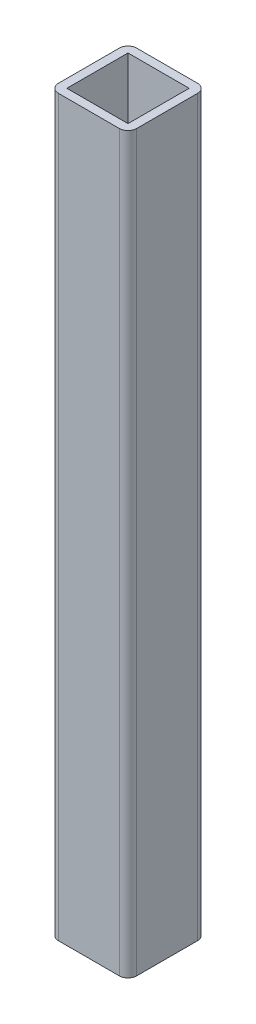
ISO-10303-21;
HEADER;
FILE_DESCRIPTION(('STEP AP214'),'2;1');
FILE_NAME('part.step','',(''),(''),'','','');
FILE_SCHEMA(('AUTOMOTIVE_DESIGN { 1 0 10303 214 1 1 1 1 }'));
ENDSEC;
DATA;
#1=APPLICATION_CONTEXT('core data for automotive mechanical design processes');
#2=APPLICATION_PROTOCOL_DEFINITION('international standard','automotive_design',2000,#1);
#3=PRODUCT_CONTEXT('',#1,'mechanical');
#4=PRODUCT('Part','Part','',(#3));
#5=PRODUCT_RELATED_PRODUCT_CATEGORY('part','',(#4));
#6=PRODUCT_DEFINITION_FORMATION('','',#4);
#7=PRODUCT_DEFINITION_CONTEXT('part definition',#1,'design');
#8=PRODUCT_DEFINITION('design','',#6,#7);
#9=PRODUCT_DEFINITION_SHAPE('','',#8);
#10=(LENGTH_UNIT() NAMED_UNIT(*) SI_UNIT(.MILLI.,.METRE.));
#11=(NAMED_UNIT(*) PLANE_ANGLE_UNIT() SI_UNIT($,.RADIAN.));
#12=(NAMED_UNIT(*) SI_UNIT($,.STERADIAN.) SOLID_ANGLE_UNIT());
#13=UNCERTAINTY_MEASURE_WITH_UNIT(LENGTH_MEASURE(1.E-05),#10,'distance_accuracy_value','');
#14=(GEOMETRIC_REPRESENTATION_CONTEXT(3) GLOBAL_UNCERTAINTY_ASSIGNED_CONTEXT((#13)) GLOBAL_UNIT_ASSIGNED_CONTEXT((#10,
#11,#12)) REPRESENTATION_CONTEXT('',''));
#15=CARTESIAN_POINT('',(0.,0.,0.));
#16=DIRECTION('',(0.,0.,1.));
#17=DIRECTION('',(1.,0.,0.));
#18=AXIS2_PLACEMENT_3D('',#15,#16,#17);
#19=CARTESIAN_POINT('',(22.8,240.,2.8));
#20=DIRECTION('',(0.,-1.,0.));
#21=DIRECTION('',(0.,0.,-1.));
#22=AXIS2_PLACEMENT_3D('',#19,#20,#21);
#23=CYLINDRICAL_SURFACE('',#22,2.8);
#24=CARTESIAN_POINT('',(22.8,0.,2.8));
#25=DIRECTION('',(0.,1.,0.));
#26=DIRECTION('',(0.,0.,-1.));
#27=AXIS2_PLACEMENT_3D('',#24,#25,#26);
#28=CIRCLE('',#27,2.8);
#29=CARTESIAN_POINT('',(25.6,0.,2.80000000000002));
#30=VERTEX_POINT('',#29);
#31=CARTESIAN_POINT('',(22.8,0.,0.));
#32=VERTEX_POINT('',#31);
#33=EDGE_CURVE('E159',#30,#32,#28,.T.);
#34=ORIENTED_EDGE('',*,*,#33,.T.);
#35=DIRECTION('',(0.,-1.,0.));
#36=VECTOR('',#35,1.);
#37=CARTESIAN_POINT('',(22.8,240.,0.));
#38=LINE('',#37,#36);
#39=CARTESIAN_POINT('',(22.8,240.,0.));
#40=VERTEX_POINT('',#39);
#41=EDGE_CURVE('E11',#40,#32,#38,.T.);
#42=ORIENTED_EDGE('',*,*,#41,.F.);
#43=CARTESIAN_POINT('',(22.8,240.,2.8));
#44=DIRECTION('',(0.,1.,0.));
#45=DIRECTION('',(0.,0.,-1.));
#46=AXIS2_PLACEMENT_3D('',#43,#44,#45);
#47=CIRCLE('',#46,2.8);
#48=CARTESIAN_POINT('',(25.6,240.,2.80000000000002));
#49=VERTEX_POINT('',#48);
#50=EDGE_CURVE('E160',#49,#40,#47,.T.);
#51=ORIENTED_EDGE('',*,*,#50,.F.);
#52=DIRECTION('',(0.,-1.,0.));
#53=VECTOR('',#52,1.);
#54=CARTESIAN_POINT('',(25.6,240.,2.80000000000002));
#55=LINE('',#54,#53);
#56=EDGE_CURVE('E178',#49,#30,#55,.T.);
#57=ORIENTED_EDGE('',*,*,#56,.T.);
#58=EDGE_LOOP('',(#34,#42,#51,#57));
#59=FACE_BOUND('',#58,.T.);
#60=ADVANCED_FACE('F34',(#59),#23,.T.);
#61=CARTESIAN_POINT('',(2.80000000000002,240.,0.));
#62=DIRECTION('',(0.,0.,1.));
#63=DIRECTION('',(1.,0.,0.));
#64=AXIS2_PLACEMENT_3D('',#61,#62,#63);
#65=PLANE('',#64);
#66=DIRECTION('',(-1.,0.,0.));
#67=VECTOR('',#66,1.);
#68=CARTESIAN_POINT('',(2.80000000000002,0.,0.));
#69=LINE('',#68,#67);
#70=CARTESIAN_POINT('',(2.80000000000002,0.,0.));
#71=VERTEX_POINT('',#70);
#72=EDGE_CURVE('E181',#32,#71,#69,.T.);
#73=ORIENTED_EDGE('',*,*,#72,.T.);
#74=DIRECTION('',(0.,-1.,0.));
#75=VECTOR('',#74,1.);
#76=CARTESIAN_POINT('',(2.80000000000002,240.,0.));
#77=LINE('',#76,#75);
#78=CARTESIAN_POINT('',(2.80000000000002,240.,0.));
#79=VERTEX_POINT('',#78);
#80=EDGE_CURVE('E41',#79,#71,#77,.T.);
#81=ORIENTED_EDGE('',*,*,#80,.F.);
#82=DIRECTION('',(-1.,0.,0.));
#83=VECTOR('',#82,1.);
#84=CARTESIAN_POINT('',(2.80000000000002,240.,0.));
#85=LINE('',#84,#83);
#86=EDGE_CURVE('E163',#40,#79,#85,.T.);
#87=ORIENTED_EDGE('',*,*,#86,.F.);
#88=ORIENTED_EDGE('',*,*,#41,.T.);
#89=EDGE_LOOP('',(#73,#81,#87,#88));
#90=FACE_BOUND('',#89,.T.);
#91=ADVANCED_FACE('F236',(#90),#65,.F.);
#92=CARTESIAN_POINT('',(2.8,240.,2.8));
#93=DIRECTION('',(0.,-1.,0.));
#94=DIRECTION('',(0.,0.,-1.));
#95=AXIS2_PLACEMENT_3D('',#92,#93,#94);
#96=CYLINDRICAL_SURFACE('',#95,2.8);
#97=CARTESIAN_POINT('',(2.8,0.,2.8));
#98=DIRECTION('',(0.,1.,0.));
#99=DIRECTION('',(0.,0.,1.));
#100=AXIS2_PLACEMENT_3D('',#97,#98,#99);
#101=CIRCLE('',#100,2.8);
#102=CARTESIAN_POINT('',(0.,0.,2.80000000000002));
#103=VERTEX_POINT('',#102);
#104=EDGE_CURVE('E183',#71,#103,#101,.T.);
#105=ORIENTED_EDGE('',*,*,#104,.T.);
#106=DIRECTION('',(0.,-1.,0.));
#107=VECTOR('',#106,1.);
#108=CARTESIAN_POINT('',(0.,240.,2.80000000000002));
#109=LINE('',#108,#107);
#110=CARTESIAN_POINT('',(0.,240.,2.80000000000002));
#111=VERTEX_POINT('',#110);
#112=EDGE_CURVE('E208',#111,#103,#109,.T.);
#113=ORIENTED_EDGE('',*,*,#112,.F.);
#114=CARTESIAN_POINT('',(2.8,240.,2.8));
#115=DIRECTION('',(0.,1.,0.));
#116=DIRECTION('',(0.,0.,1.));
#117=AXIS2_PLACEMENT_3D('',#114,#115,#116);
#118=CIRCLE('',#117,2.8);
#119=EDGE_CURVE('E166',#79,#111,#118,.T.);
#120=ORIENTED_EDGE('',*,*,#119,.F.);
#121=ORIENTED_EDGE('',*,*,#80,.T.);
#122=EDGE_LOOP('',(#105,#113,#120,#121));
#123=FACE_BOUND('',#122,.T.);
#124=ADVANCED_FACE('F215',(#123),#96,.T.);
#125=CARTESIAN_POINT('',(0.,240.,2.80000000000002));
#126=DIRECTION('',(1.,0.,0.));
#127=DIRECTION('',(0.,0.,-1.));
#128=AXIS2_PLACEMENT_3D('',#125,#126,#127);
#129=PLANE('',#128);
#130=DIRECTION('',(0.,0.,1.));
#131=VECTOR('',#130,1.);
#132=CARTESIAN_POINT('',(0.,0.,2.80000000000002));
#133=LINE('',#132,#131);
#134=CARTESIAN_POINT('',(0.,0.,22.8));
#135=VERTEX_POINT('',#134);
#136=EDGE_CURVE('E185',#103,#135,#133,.T.);
#137=ORIENTED_EDGE('',*,*,#136,.T.);
#138=DIRECTION('',(0.,-1.,0.));
#139=VECTOR('',#138,1.);
#140=CARTESIAN_POINT('',(0.,240.,22.8));
#141=LINE('',#140,#139);
#142=CARTESIAN_POINT('',(0.,240.,22.8));
#143=VERTEX_POINT('',#142);
#144=EDGE_CURVE('E205',#143,#135,#141,.T.);
#145=ORIENTED_EDGE('',*,*,#144,.F.);
#146=DIRECTION('',(0.,0.,1.));
#147=VECTOR('',#146,1.);
#148=CARTESIAN_POINT('',(0.,240.,2.80000000000002));
#149=LINE('',#148,#147);
#150=EDGE_CURVE('E168',#111,#143,#149,.T.);
#151=ORIENTED_EDGE('',*,*,#150,.F.);
#152=ORIENTED_EDGE('',*,*,#112,.T.);
#153=EDGE_LOOP('',(#137,#145,#151,#152));
#154=FACE_BOUND('',#153,.T.);
#155=ADVANCED_FACE('F224',(#154),#129,.F.);
#156=CARTESIAN_POINT('',(2.8,240.,22.8));
#157=DIRECTION('',(0.,-1.,0.));
#158=DIRECTION('',(0.,0.,-1.));
#159=AXIS2_PLACEMENT_3D('',#156,#157,#158);
#160=CYLINDRICAL_SURFACE('',#159,2.8);
#161=CARTESIAN_POINT('',(2.8,0.,22.8));
#162=DIRECTION('',(0.,1.,0.));
#163=DIRECTION('',(0.,0.,1.));
#164=AXIS2_PLACEMENT_3D('',#161,#162,#163);
#165=CIRCLE('',#164,2.8);
#166=CARTESIAN_POINT('',(2.80000000000002,0.,25.6));
#167=VERTEX_POINT('',#166);
#168=EDGE_CURVE('E187',#135,#167,#165,.T.);
#169=ORIENTED_EDGE('',*,*,#168,.T.);
#170=DIRECTION('',(0.,-1.,0.));
#171=VECTOR('',#170,1.);
#172=CARTESIAN_POINT('',(2.80000000000002,240.,25.6));
#173=LINE('',#172,#171);
#174=CARTESIAN_POINT('',(2.80000000000002,240.,25.6));
#175=VERTEX_POINT('',#174);
#176=EDGE_CURVE('E202',#175,#167,#173,.T.);
#177=ORIENTED_EDGE('',*,*,#176,.F.);
#178=CARTESIAN_POINT('',(2.8,240.,22.8));
#179=DIRECTION('',(0.,1.,0.));
#180=DIRECTION('',(0.,0.,1.));
#181=AXIS2_PLACEMENT_3D('',#178,#179,#180);
#182=CIRCLE('',#181,2.8);
#183=EDGE_CURVE('E170',#143,#175,#182,.T.);
#184=ORIENTED_EDGE('',*,*,#183,.F.);
#185=ORIENTED_EDGE('',*,*,#144,.T.);
#186=EDGE_LOOP('',(#169,#177,#184,#185));
#187=FACE_BOUND('',#186,.T.);
#188=ADVANCED_FACE('F228',(#187),#160,.T.);
#189=CARTESIAN_POINT('',(2.80000000000002,240.,25.6));
#190=DIRECTION('',(0.,0.,-1.));
#191=DIRECTION('',(-1.,0.,0.));
#192=AXIS2_PLACEMENT_3D('',#189,#190,#191);
#193=PLANE('',#192);
#194=DIRECTION('',(1.,0.,0.));
#195=VECTOR('',#194,1.);
#196=CARTESIAN_POINT('',(2.80000000000002,0.,25.6));
#197=LINE('',#196,#195);
#198=CARTESIAN_POINT('',(22.8,0.,25.6));
#199=VERTEX_POINT('',#198);
#200=EDGE_CURVE('E189',#167,#199,#197,.T.);
#201=ORIENTED_EDGE('',*,*,#200,.T.);
#202=DIRECTION('',(0.,-1.,0.));
#203=VECTOR('',#202,1.);
#204=CARTESIAN_POINT('',(22.8,240.,25.6));
#205=LINE('',#204,#203);
#206=CARTESIAN_POINT('',(22.8,240.,25.6));
#207=VERTEX_POINT('',#206);
#208=EDGE_CURVE('E199',#207,#199,#205,.T.);
#209=ORIENTED_EDGE('',*,*,#208,.F.);
#210=DIRECTION('',(1.,0.,0.));
#211=VECTOR('',#210,1.);
#212=CARTESIAN_POINT('',(2.80000000000002,240.,25.6));
#213=LINE('',#212,#211);
#214=EDGE_CURVE('E172',#175,#207,#213,.T.);
#215=ORIENTED_EDGE('',*,*,#214,.F.);
#216=ORIENTED_EDGE('',*,*,#176,.T.);
#217=EDGE_LOOP('',(#201,#209,#215,#216));
#218=FACE_BOUND('',#217,.T.);
#219=ADVANCED_FACE('F249',(#218),#193,.F.);
#220=CARTESIAN_POINT('',(22.8,240.,22.8));
#221=DIRECTION('',(0.,-1.,0.));
#222=DIRECTION('',(0.,0.,-1.));
#223=AXIS2_PLACEMENT_3D('',#220,#221,#222);
#224=CYLINDRICAL_SURFACE('',#223,2.8);
#225=CARTESIAN_POINT('',(22.8,0.,22.8));
#226=DIRECTION('',(0.,1.,0.));
#227=DIRECTION('',(0.,0.,1.));
#228=AXIS2_PLACEMENT_3D('',#225,#226,#227);
#229=CIRCLE('',#228,2.8);
#230=CARTESIAN_POINT('',(25.6,0.,22.8));
#231=VERTEX_POINT('',#230);
#232=EDGE_CURVE('E191',#199,#231,#229,.T.);
#233=ORIENTED_EDGE('',*,*,#232,.T.);
#234=DIRECTION('',(0.,-1.,0.));
#235=VECTOR('',#234,1.);
#236=CARTESIAN_POINT('',(25.6,240.,22.8));
#237=LINE('',#236,#235);
#238=CARTESIAN_POINT('',(25.6,240.,22.8));
#239=VERTEX_POINT('',#238);
#240=EDGE_CURVE('E196',#239,#231,#237,.T.);
#241=ORIENTED_EDGE('',*,*,#240,.F.);
#242=CARTESIAN_POINT('',(22.8,240.,22.8));
#243=DIRECTION('',(0.,1.,0.));
#244=DIRECTION('',(0.,0.,1.));
#245=AXIS2_PLACEMENT_3D('',#242,#243,#244);
#246=CIRCLE('',#245,2.8);
#247=EDGE_CURVE('E174',#207,#239,#246,.T.);
#248=ORIENTED_EDGE('',*,*,#247,.F.);
#249=ORIENTED_EDGE('',*,*,#208,.T.);
#250=EDGE_LOOP('',(#233,#241,#248,#249));
#251=FACE_BOUND('',#250,.T.);
#252=ADVANCED_FACE('F247',(#251),#224,.T.);
#253=CARTESIAN_POINT('',(25.6,240.,2.80000000000002));
#254=DIRECTION('',(-1.,0.,0.));
#255=DIRECTION('',(0.,0.,1.));
#256=AXIS2_PLACEMENT_3D('',#253,#254,#255);
#257=PLANE('',#256);
#258=DIRECTION('',(0.,0.,-1.));
#259=VECTOR('',#258,1.);
#260=CARTESIAN_POINT('',(25.6,0.,2.80000000000002));
#261=LINE('',#260,#259);
#262=EDGE_CURVE('E164',#231,#30,#261,.T.);
#263=ORIENTED_EDGE('',*,*,#262,.T.);
#264=ORIENTED_EDGE('',*,*,#56,.F.);
#265=DIRECTION('',(0.,0.,-1.));
#266=VECTOR('',#265,1.);
#267=CARTESIAN_POINT('',(25.6,240.,2.80000000000002));
#268=LINE('',#267,#266);
#269=EDGE_CURVE('E176',#239,#49,#268,.T.);
#270=ORIENTED_EDGE('',*,*,#269,.F.);
#271=ORIENTED_EDGE('',*,*,#240,.T.);
#272=EDGE_LOOP('',(#263,#264,#270,#271));
#273=FACE_BOUND('',#272,.T.);
#274=ADVANCED_FACE('F242',(#273),#257,.F.);
#275=CARTESIAN_POINT('',(22.8,240.,2.8));
#276=DIRECTION('',(0.,-1.,0.));
#277=DIRECTION('',(0.,0.,-1.));
#278=AXIS2_PLACEMENT_3D('',#275,#276,#277);
#279=PLANE('',#278);
#280=DIRECTION('',(1.,0.,0.));
#281=VECTOR('',#280,1.);
#282=CARTESIAN_POINT('',(22.8,240.,2.8));
#283=LINE('',#282,#281);
#284=CARTESIAN_POINT('',(2.8,240.,2.8));
#285=VERTEX_POINT('',#284);
#286=CARTESIAN_POINT('',(22.8,240.,2.8));
#287=VERTEX_POINT('',#286);
#288=EDGE_CURVE('E153',#285,#287,#283,.T.);
#289=ORIENTED_EDGE('',*,*,#288,.T.);
#290=DIRECTION('',(0.,0.,1.));
#291=VECTOR('',#290,1.);
#292=CARTESIAN_POINT('',(22.8,240.,2.8));
#293=LINE('',#292,#291);
#294=CARTESIAN_POINT('',(22.8,240.,22.8));
#295=VERTEX_POINT('',#294);
#296=EDGE_CURVE('E156',#287,#295,#293,.T.);
#297=ORIENTED_EDGE('',*,*,#296,.T.);
#298=DIRECTION('',(-1.,0.,0.));
#299=VECTOR('',#298,1.);
#300=CARTESIAN_POINT('',(22.8,240.,22.8));
#301=LINE('',#300,#299);
#302=CARTESIAN_POINT('',(2.8,240.,22.8));
#303=VERTEX_POINT('',#302);
#304=EDGE_CURVE('E148',#295,#303,#301,.T.);
#305=ORIENTED_EDGE('',*,*,#304,.T.);
#306=DIRECTION('',(0.,0.,-1.));
#307=VECTOR('',#306,1.);
#308=CARTESIAN_POINT('',(2.8,240.,2.79999999999999));
#309=LINE('',#308,#307);
#310=EDGE_CURVE('E128',#303,#285,#309,.T.);
#311=ORIENTED_EDGE('',*,*,#310,.T.);
#312=EDGE_LOOP('',(#289,#297,#305,#311));
#313=FACE_BOUND('',#312,.T.);
#314=ORIENTED_EDGE('',*,*,#50,.T.);
#315=ORIENTED_EDGE('',*,*,#86,.T.);
#316=ORIENTED_EDGE('',*,*,#119,.T.);
#317=ORIENTED_EDGE('',*,*,#150,.T.);
#318=ORIENTED_EDGE('',*,*,#183,.T.);
#319=ORIENTED_EDGE('',*,*,#214,.T.);
#320=ORIENTED_EDGE('',*,*,#247,.T.);
#321=ORIENTED_EDGE('',*,*,#269,.T.);
#322=EDGE_LOOP('',(#314,#315,#316,#317,#318,#319,#320,#321));
#323=FACE_BOUND('',#322,.T.);
#324=ADVANCED_FACE('F232',(#313,#323),#279,.F.);
#325=CARTESIAN_POINT('',(22.8,0.,2.8));
#326=DIRECTION('',(0.,-1.,0.));
#327=DIRECTION('',(0.,0.,-1.));
#328=AXIS2_PLACEMENT_3D('',#325,#326,#327);
#329=PLANE('',#328);
#330=DIRECTION('',(0.,0.,1.));
#331=VECTOR('',#330,1.);
#332=CARTESIAN_POINT('',(22.8,0.,2.8));
#333=LINE('',#332,#331);
#334=CARTESIAN_POINT('',(22.8,0.,2.8));
#335=VERTEX_POINT('',#334);
#336=CARTESIAN_POINT('',(22.8,0.,22.8));
#337=VERTEX_POINT('',#336);
#338=EDGE_CURVE('E56',#335,#337,#333,.T.);
#339=ORIENTED_EDGE('',*,*,#338,.F.);
#340=DIRECTION('',(1.,0.,0.));
#341=VECTOR('',#340,1.);
#342=CARTESIAN_POINT('',(2.8,0.,2.8));
#343=LINE('',#342,#341);
#344=CARTESIAN_POINT('',(2.8,0.,2.8));
#345=VERTEX_POINT('',#344);
#346=EDGE_CURVE('E141',#345,#335,#343,.T.);
#347=ORIENTED_EDGE('',*,*,#346,.F.);
#348=DIRECTION('',(0.,0.,-1.));
#349=VECTOR('',#348,1.);
#350=CARTESIAN_POINT('',(2.8,0.,2.8));
#351=LINE('',#350,#349);
#352=CARTESIAN_POINT('',(2.8,0.,22.8));
#353=VERTEX_POINT('',#352);
#354=EDGE_CURVE('E125',#353,#345,#351,.T.);
#355=ORIENTED_EDGE('',*,*,#354,.F.);
#356=DIRECTION('',(-1.,0.,0.));
#357=VECTOR('',#356,1.);
#358=CARTESIAN_POINT('',(2.8,0.,22.8));
#359=LINE('',#358,#357);
#360=EDGE_CURVE('E134',#337,#353,#359,.T.);
#361=ORIENTED_EDGE('',*,*,#360,.F.);
#362=EDGE_LOOP('',(#339,#347,#355,#361));
#363=FACE_BOUND('',#362,.T.);
#364=ORIENTED_EDGE('',*,*,#33,.F.);
#365=ORIENTED_EDGE('',*,*,#262,.F.);
#366=ORIENTED_EDGE('',*,*,#232,.F.);
#367=ORIENTED_EDGE('',*,*,#200,.F.);
#368=ORIENTED_EDGE('',*,*,#168,.F.);
#369=ORIENTED_EDGE('',*,*,#136,.F.);
#370=ORIENTED_EDGE('',*,*,#104,.F.);
#371=ORIENTED_EDGE('',*,*,#72,.F.);
#372=EDGE_LOOP('',(#364,#365,#366,#367,#368,#369,#370,#371));
#373=FACE_BOUND('',#372,.T.);
#374=ADVANCED_FACE('F138',(#363,#373),#329,.T.);
#375=CARTESIAN_POINT('',(22.8,1040.5,2.8));
#376=DIRECTION('',(1.,0.,0.));
#377=DIRECTION('',(0.,0.,-1.));
#378=AXIS2_PLACEMENT_3D('',#375,#376,#377);
#379=PLANE('',#378);
#380=DIRECTION('',(0.,-1.,0.));
#381=VECTOR('',#380,1.);
#382=CARTESIAN_POINT('',(22.8,1040.5,2.8));
#383=LINE('',#382,#381);
#384=EDGE_CURVE('E146',#287,#335,#383,.T.);
#385=ORIENTED_EDGE('',*,*,#384,.T.);
#386=ORIENTED_EDGE('',*,*,#338,.T.);
#387=DIRECTION('',(0.,-1.,0.));
#388=VECTOR('',#387,1.);
#389=CARTESIAN_POINT('',(22.8,1040.5,22.8));
#390=LINE('',#389,#388);
#391=EDGE_CURVE('E131',#295,#337,#390,.T.);
#392=ORIENTED_EDGE('',*,*,#391,.F.);
#393=ORIENTED_EDGE('',*,*,#296,.F.);
#394=EDGE_LOOP('',(#385,#386,#392,#393));
#395=FACE_BOUND('',#394,.T.);
#396=ADVANCED_FACE('F312',(#395),#379,.F.);
#397=CARTESIAN_POINT('',(2.8,1040.5,2.8));
#398=DIRECTION('',(0.,0.,-1.));
#399=DIRECTION('',(-1.,0.,0.));
#400=AXIS2_PLACEMENT_3D('',#397,#398,#399);
#401=PLANE('',#400);
#402=DIRECTION('',(0.,-1.,0.));
#403=VECTOR('',#402,1.);
#404=CARTESIAN_POINT('',(2.8,1040.5,2.8));
#405=LINE('',#404,#403);
#406=EDGE_CURVE('E130',#285,#345,#405,.T.);
#407=ORIENTED_EDGE('',*,*,#406,.T.);
#408=ORIENTED_EDGE('',*,*,#346,.T.);
#409=ORIENTED_EDGE('',*,*,#384,.F.);
#410=ORIENTED_EDGE('',*,*,#288,.F.);
#411=EDGE_LOOP('',(#407,#408,#409,#410));
#412=FACE_BOUND('',#411,.T.);
#413=ADVANCED_FACE('F321',(#412),#401,.F.);
#414=CARTESIAN_POINT('',(2.8,1040.5,2.8));
#415=DIRECTION('',(-1.,0.,0.));
#416=DIRECTION('',(0.,0.,1.));
#417=AXIS2_PLACEMENT_3D('',#414,#415,#416);
#418=PLANE('',#417);
#419=DIRECTION('',(0.,-1.,0.));
#420=VECTOR('',#419,1.);
#421=CARTESIAN_POINT('',(2.8,1040.5,22.8));
#422=LINE('',#421,#420);
#423=EDGE_CURVE('E48',#303,#353,#422,.T.);
#424=ORIENTED_EDGE('',*,*,#423,.T.);
#425=ORIENTED_EDGE('',*,*,#354,.T.);
#426=ORIENTED_EDGE('',*,*,#406,.F.);
#427=ORIENTED_EDGE('',*,*,#310,.F.);
#428=EDGE_LOOP('',(#424,#425,#426,#427));
#429=FACE_BOUND('',#428,.T.);
#430=ADVANCED_FACE('F122',(#429),#418,.F.);
#431=CARTESIAN_POINT('',(2.8,1040.5,22.8));
#432=DIRECTION('',(0.,0.,1.));
#433=DIRECTION('',(1.,0.,0.));
#434=AXIS2_PLACEMENT_3D('',#431,#432,#433);
#435=PLANE('',#434);
#436=ORIENTED_EDGE('',*,*,#391,.T.);
#437=ORIENTED_EDGE('',*,*,#360,.T.);
#438=ORIENTED_EDGE('',*,*,#423,.F.);
#439=ORIENTED_EDGE('',*,*,#304,.F.);
#440=EDGE_LOOP('',(#436,#437,#438,#439));
#441=FACE_BOUND('',#440,.T.);
#442=ADVANCED_FACE('F135',(#441),#435,.F.);
#443=CLOSED_SHELL('',(#60,#91,#124,#155,#188,#219,#252,#274,#324,#374,#396,#413,#430,#442));
#444=MANIFOLD_SOLID_BREP('B2',#443);
#445=ADVANCED_BREP_SHAPE_REPRESENTATION('',(#18,#444),#14);
#446=SHAPE_DEFINITION_REPRESENTATION(#9,#445);
ENDSEC;
END-ISO-10303-21;
